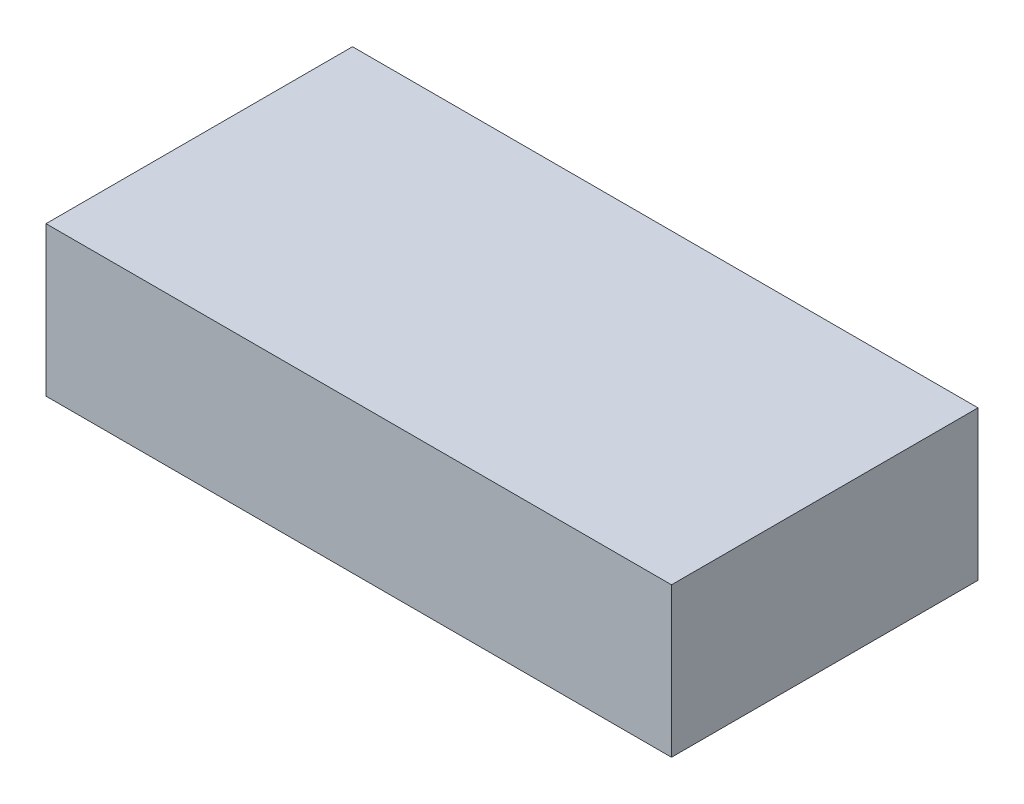
ISO-10303-21;
HEADER;
FILE_DESCRIPTION(('STEP AP214'),'2;1');
FILE_NAME('part.step','',(''),(''),'','','');
FILE_SCHEMA(('AUTOMOTIVE_DESIGN { 1 0 10303 214 1 1 1 1 }'));
ENDSEC;
DATA;
#1=APPLICATION_CONTEXT('core data for automotive mechanical design processes');
#2=APPLICATION_PROTOCOL_DEFINITION('international standard','automotive_design',2000,#1);
#3=PRODUCT_CONTEXT('',#1,'mechanical');
#4=PRODUCT('Part','Part','',(#3));
#5=PRODUCT_RELATED_PRODUCT_CATEGORY('part','',(#4));
#6=PRODUCT_DEFINITION_FORMATION('','',#4);
#7=PRODUCT_DEFINITION_CONTEXT('part definition',#1,'design');
#8=PRODUCT_DEFINITION('design','',#6,#7);
#9=PRODUCT_DEFINITION_SHAPE('','',#8);
#10=(LENGTH_UNIT() NAMED_UNIT(*) SI_UNIT(.MILLI.,.METRE.));
#11=(NAMED_UNIT(*) PLANE_ANGLE_UNIT() SI_UNIT($,.RADIAN.));
#12=(NAMED_UNIT(*) SI_UNIT($,.STERADIAN.) SOLID_ANGLE_UNIT());
#13=UNCERTAINTY_MEASURE_WITH_UNIT(LENGTH_MEASURE(1.E-05),#10,'distance_accuracy_value','');
#14=(GEOMETRIC_REPRESENTATION_CONTEXT(3) GLOBAL_UNCERTAINTY_ASSIGNED_CONTEXT((#13)) GLOBAL_UNIT_ASSIGNED_CONTEXT((#10,
#11,#12)) REPRESENTATION_CONTEXT('',''));
#15=CARTESIAN_POINT('',(0.,0.,0.));
#16=DIRECTION('',(0.,0.,1.));
#17=DIRECTION('',(1.,0.,0.));
#18=AXIS2_PLACEMENT_3D('',#15,#16,#17);
#19=CARTESIAN_POINT('',(-36.57,19.07,17.92));
#20=DIRECTION('',(0.,0.,-1.));
#21=DIRECTION('',(-1.,0.,0.));
#22=AXIS2_PLACEMENT_3D('',#19,#20,#21);
#23=PLANE('',#22);
#24=DIRECTION('',(1.,0.,0.));
#25=VECTOR('',#24,1.);
#26=CARTESIAN_POINT('',(-36.57,1.6,17.92));
#27=LINE('',#26,#25);
#28=CARTESIAN_POINT('',(-36.57,1.6,17.92));
#29=VERTEX_POINT('',#28);
#30=CARTESIAN_POINT('',(36.57,1.6,17.92));
#31=VERTEX_POINT('',#30);
#32=EDGE_CURVE('E55',#29,#31,#27,.T.);
#33=ORIENTED_EDGE('',*,*,#32,.T.);
#34=DIRECTION('',(0.,-1.,0.));
#35=VECTOR('',#34,1.);
#36=CARTESIAN_POINT('',(36.57,19.07,17.92));
#37=LINE('',#36,#35);
#38=CARTESIAN_POINT('',(36.57,19.07,17.92));
#39=VERTEX_POINT('',#38);
#40=EDGE_CURVE('E11',#39,#31,#37,.T.);
#41=ORIENTED_EDGE('',*,*,#40,.F.);
#42=DIRECTION('',(1.,0.,0.));
#43=VECTOR('',#42,1.);
#44=CARTESIAN_POINT('',(-36.57,19.07,17.92));
#45=LINE('',#44,#43);
#46=CARTESIAN_POINT('',(-36.57,19.07,17.92));
#47=VERTEX_POINT('',#46);
#48=EDGE_CURVE('E88',#47,#39,#45,.T.);
#49=ORIENTED_EDGE('',*,*,#48,.F.);
#50=DIRECTION('',(0.,-1.,0.));
#51=VECTOR('',#50,1.);
#52=CARTESIAN_POINT('',(-36.57,19.07,17.92));
#53=LINE('',#52,#51);
#54=EDGE_CURVE('E102',#47,#29,#53,.T.);
#55=ORIENTED_EDGE('',*,*,#54,.T.);
#56=EDGE_LOOP('',(#33,#41,#49,#55));
#57=FACE_BOUND('',#56,.T.);
#58=ADVANCED_FACE('F40',(#57),#23,.F.);
#59=CARTESIAN_POINT('',(36.57,19.07,17.92));
#60=DIRECTION('',(-1.,0.,0.));
#61=DIRECTION('',(0.,0.,1.));
#62=AXIS2_PLACEMENT_3D('',#59,#60,#61);
#63=PLANE('',#62);
#64=DIRECTION('',(0.,0.,-1.));
#65=VECTOR('',#64,1.);
#66=CARTESIAN_POINT('',(36.57,1.6,17.92));
#67=LINE('',#66,#65);
#68=CARTESIAN_POINT('',(36.57,1.6,-17.92));
#69=VERTEX_POINT('',#68);
#70=EDGE_CURVE('E98',#31,#69,#67,.T.);
#71=ORIENTED_EDGE('',*,*,#70,.T.);
#72=DIRECTION('',(0.,-1.,0.));
#73=VECTOR('',#72,1.);
#74=CARTESIAN_POINT('',(36.57,19.07,-17.92));
#75=LINE('',#74,#73);
#76=CARTESIAN_POINT('',(36.57,19.07,-17.92));
#77=VERTEX_POINT('',#76);
#78=EDGE_CURVE('E48',#77,#69,#75,.T.);
#79=ORIENTED_EDGE('',*,*,#78,.F.);
#80=DIRECTION('',(0.,0.,-1.));
#81=VECTOR('',#80,1.);
#82=CARTESIAN_POINT('',(36.57,19.07,17.92));
#83=LINE('',#82,#81);
#84=EDGE_CURVE('E117',#39,#77,#83,.T.);
#85=ORIENTED_EDGE('',*,*,#84,.F.);
#86=ORIENTED_EDGE('',*,*,#40,.T.);
#87=EDGE_LOOP('',(#71,#79,#85,#86));
#88=FACE_BOUND('',#87,.T.);
#89=ADVANCED_FACE('F126',(#88),#63,.F.);
#90=CARTESIAN_POINT('',(-36.57,19.07,-17.92));
#91=DIRECTION('',(0.,0.,1.));
#92=DIRECTION('',(1.,0.,0.));
#93=AXIS2_PLACEMENT_3D('',#90,#91,#92);
#94=PLANE('',#93);
#95=DIRECTION('',(-1.,0.,0.));
#96=VECTOR('',#95,1.);
#97=CARTESIAN_POINT('',(-36.57,1.6,-17.92));
#98=LINE('',#97,#96);
#99=CARTESIAN_POINT('',(-36.57,1.6,-17.92));
#100=VERTEX_POINT('',#99);
#101=EDGE_CURVE('E82',#69,#100,#98,.T.);
#102=ORIENTED_EDGE('',*,*,#101,.T.);
#103=DIRECTION('',(0.,-1.,0.));
#104=VECTOR('',#103,1.);
#105=CARTESIAN_POINT('',(-36.57,19.07,-17.92));
#106=LINE('',#105,#104);
#107=CARTESIAN_POINT('',(-36.57,19.07,-17.92));
#108=VERTEX_POINT('',#107);
#109=EDGE_CURVE('E95',#108,#100,#106,.T.);
#110=ORIENTED_EDGE('',*,*,#109,.F.);
#111=DIRECTION('',(-1.,0.,0.));
#112=VECTOR('',#111,1.);
#113=CARTESIAN_POINT('',(-36.57,19.07,-17.92));
#114=LINE('',#113,#112);
#115=EDGE_CURVE('E114',#77,#108,#114,.T.);
#116=ORIENTED_EDGE('',*,*,#115,.F.);
#117=ORIENTED_EDGE('',*,*,#78,.T.);
#118=EDGE_LOOP('',(#102,#110,#116,#117));
#119=FACE_BOUND('',#118,.T.);
#120=ADVANCED_FACE('F93',(#119),#94,.F.);
#121=CARTESIAN_POINT('',(-36.57,19.07,17.92));
#122=DIRECTION('',(1.,0.,0.));
#123=DIRECTION('',(0.,0.,-1.));
#124=AXIS2_PLACEMENT_3D('',#121,#122,#123);
#125=PLANE('',#124);
#126=DIRECTION('',(0.,0.,1.));
#127=VECTOR('',#126,1.);
#128=CARTESIAN_POINT('',(-36.57,1.6,17.92));
#129=LINE('',#128,#127);
#130=EDGE_CURVE('E79',#100,#29,#129,.T.);
#131=ORIENTED_EDGE('',*,*,#130,.T.);
#132=ORIENTED_EDGE('',*,*,#54,.F.);
#133=DIRECTION('',(0.,0.,1.));
#134=VECTOR('',#133,1.);
#135=CARTESIAN_POINT('',(-36.57,19.07,17.92));
#136=LINE('',#135,#134);
#137=EDGE_CURVE('E63',#108,#47,#136,.T.);
#138=ORIENTED_EDGE('',*,*,#137,.F.);
#139=ORIENTED_EDGE('',*,*,#109,.T.);
#140=EDGE_LOOP('',(#131,#132,#138,#139));
#141=FACE_BOUND('',#140,.T.);
#142=ADVANCED_FACE('F100',(#141),#125,.F.);
#143=CARTESIAN_POINT('',(0.,19.07,0.));
#144=DIRECTION('',(0.,1.,0.));
#145=DIRECTION('',(0.,0.,1.));
#146=AXIS2_PLACEMENT_3D('',#143,#144,#145);
#147=PLANE('',#146);
#148=ORIENTED_EDGE('',*,*,#48,.T.);
#149=ORIENTED_EDGE('',*,*,#84,.T.);
#150=ORIENTED_EDGE('',*,*,#115,.T.);
#151=ORIENTED_EDGE('',*,*,#137,.T.);
#152=EDGE_LOOP('',(#148,#149,#150,#151));
#153=FACE_BOUND('',#152,.T.);
#154=ADVANCED_FACE('F123',(#153),#147,.T.);
#155=CARTESIAN_POINT('',(0.,1.6,0.));
#156=DIRECTION('',(0.,-1.,0.));
#157=DIRECTION('',(0.,0.,-1.));
#158=AXIS2_PLACEMENT_3D('',#155,#156,#157);
#159=PLANE('',#158);
#160=ORIENTED_EDGE('',*,*,#32,.F.);
#161=ORIENTED_EDGE('',*,*,#130,.F.);
#162=ORIENTED_EDGE('',*,*,#101,.F.);
#163=ORIENTED_EDGE('',*,*,#70,.F.);
#164=EDGE_LOOP('',(#160,#161,#162,#163));
#165=FACE_BOUND('',#164,.T.);
#166=ADVANCED_FACE('F81',(#165),#159,.T.);
#167=CLOSED_SHELL('',(#58,#89,#120,#142,#154,#166));
#168=MANIFOLD_SOLID_BREP('B2',#167);
#169=ADVANCED_BREP_SHAPE_REPRESENTATION('',(#18,#168),#14);
#170=SHAPE_DEFINITION_REPRESENTATION(#9,#169);
ENDSEC;
END-ISO-10303-21;
